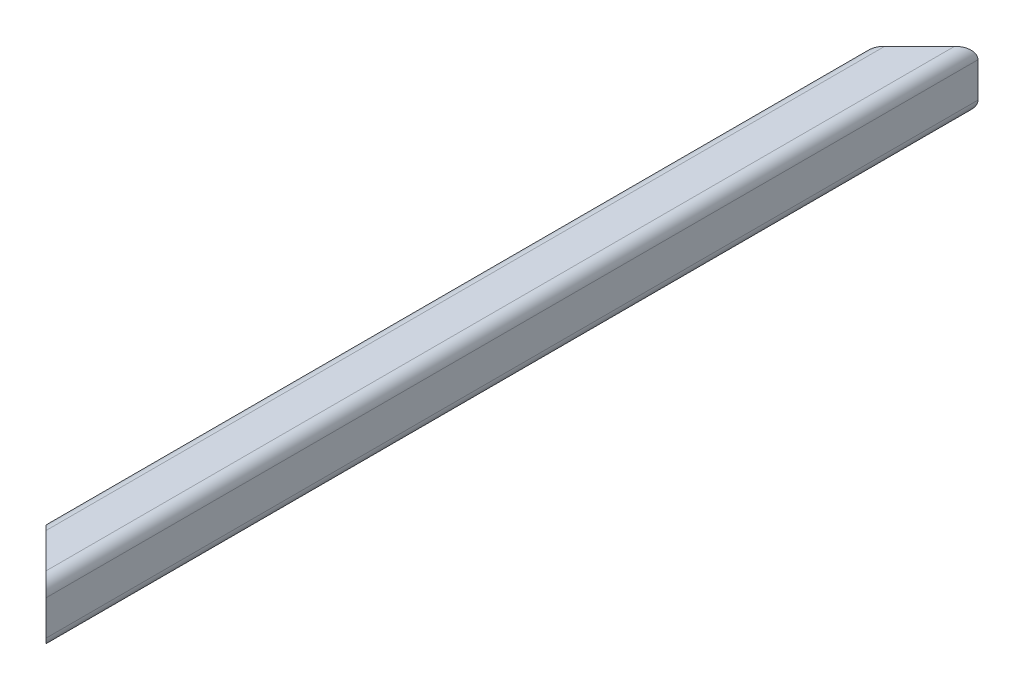
ISO-10303-21;
HEADER;
FILE_DESCRIPTION(('STEP AP214'),'2;1');
FILE_NAME('part.step','',(''),(''),'','','');
FILE_SCHEMA(('AUTOMOTIVE_DESIGN { 1 0 10303 214 1 1 1 1 }'));
ENDSEC;
DATA;
#1=APPLICATION_CONTEXT('core data for automotive mechanical design processes');
#2=APPLICATION_PROTOCOL_DEFINITION('international standard','automotive_design',2000,#1);
#3=PRODUCT_CONTEXT('',#1,'mechanical');
#4=PRODUCT('Part','Part','',(#3));
#5=PRODUCT_RELATED_PRODUCT_CATEGORY('part','',(#4));
#6=PRODUCT_DEFINITION_FORMATION('','',#4);
#7=PRODUCT_DEFINITION_CONTEXT('part definition',#1,'design');
#8=PRODUCT_DEFINITION('design','',#6,#7);
#9=PRODUCT_DEFINITION_SHAPE('','',#8);
#10=(LENGTH_UNIT() NAMED_UNIT(*) SI_UNIT(.MILLI.,.METRE.));
#11=(NAMED_UNIT(*) PLANE_ANGLE_UNIT() SI_UNIT($,.RADIAN.));
#12=(NAMED_UNIT(*) SI_UNIT($,.STERADIAN.) SOLID_ANGLE_UNIT());
#13=UNCERTAINTY_MEASURE_WITH_UNIT(LENGTH_MEASURE(1.E-05),#10,'distance_accuracy_value','');
#14=(GEOMETRIC_REPRESENTATION_CONTEXT(3) GLOBAL_UNCERTAINTY_ASSIGNED_CONTEXT((#13)) GLOBAL_UNIT_ASSIGNED_CONTEXT((#10,
#11,#12)) REPRESENTATION_CONTEXT('',''));
#15=CARTESIAN_POINT('',(0.,0.,0.));
#16=DIRECTION('',(0.,0.,1.));
#17=DIRECTION('',(1.,0.,0.));
#18=AXIS2_PLACEMENT_3D('',#15,#16,#17);
#19=CARTESIAN_POINT('',(256.,226.,-2000.));
#20=DIRECTION('',(0.,0.,-1.));
#21=DIRECTION('',(-1.,0.,0.));
#22=AXIS2_PLACEMENT_3D('',#19,#20,#21);
#23=CYLINDRICAL_SURFACE('',#22,4.);
#24=CARTESIAN_POINT('',(256.,226.,-2306.));
#25=DIRECTION('',(-0.707106781186548,0.,-0.707106781186547));
#26=DIRECTION('',(0.707106781186547,0.,-0.707106781186548));
#27=AXIS2_PLACEMENT_3D('',#24,#25,#26);
#28=ELLIPSE('',#27,5.65685424949239,4.);
#29=CARTESIAN_POINT('',(256.,230.,-2306.));
#30=VERTEX_POINT('',#29);
#31=CARTESIAN_POINT('',(260.,226.,-2310.));
#32=VERTEX_POINT('',#31);
#33=EDGE_CURVE('E185',#30,#32,#28,.T.);
#34=ORIENTED_EDGE('',*,*,#33,.F.);
#35=DIRECTION('',(0.,0.,-1.));
#36=VECTOR('',#35,1.);
#37=CARTESIAN_POINT('',(256.,230.,-2000.));
#38=LINE('',#37,#36);
#39=CARTESIAN_POINT('',(256.,230.,-1994.));
#40=VERTEX_POINT('',#39);
#41=EDGE_CURVE('E265',#40,#30,#38,.T.);
#42=ORIENTED_EDGE('',*,*,#41,.F.);
#43=CARTESIAN_POINT('',(256.,226.,-1994.));
#44=DIRECTION('',(-0.707106781186547,0.,0.707106781186548));
#45=DIRECTION('',(-0.707106781186548,0.,-0.707106781186547));
#46=AXIS2_PLACEMENT_3D('',#43,#44,#45);
#47=ELLIPSE('',#46,5.65685424949238,4.);
#48=CARTESIAN_POINT('',(260.,226.,-1990.));
#49=VERTEX_POINT('',#48);
#50=EDGE_CURVE('E176',#49,#40,#47,.T.);
#51=ORIENTED_EDGE('',*,*,#50,.F.);
#52=DIRECTION('',(0.,0.,-1.));
#53=VECTOR('',#52,1.);
#54=CARTESIAN_POINT('',(260.,226.,-2000.));
#55=LINE('',#54,#53);
#56=EDGE_CURVE('E45',#49,#32,#55,.T.);
#57=ORIENTED_EDGE('',*,*,#56,.T.);
#58=EDGE_LOOP('',(#34,#42,#51,#57));
#59=FACE_BOUND('',#58,.T.);
#60=ADVANCED_FACE('F41',(#59),#23,.T.);
#61=CARTESIAN_POINT('',(256.,230.,-2000.));
#62=DIRECTION('',(0.,-1.,0.));
#63=DIRECTION('',(0.,0.,-1.));
#64=AXIS2_PLACEMENT_3D('',#61,#62,#63);
#65=PLANE('',#64);
#66=DIRECTION('',(0.707106781186547,0.,-0.707106781186548));
#67=VECTOR('',#66,1.);
#68=CARTESIAN_POINT('',(103.,230.,-2153.));
#69=LINE('',#68,#67);
#70=CARTESIAN_POINT('',(244.,230.,-2294.));
#71=VERTEX_POINT('',#70);
#72=EDGE_CURVE('E182',#71,#30,#69,.T.);
#73=ORIENTED_EDGE('',*,*,#72,.F.);
#74=DIRECTION('',(0.,0.,-1.));
#75=VECTOR('',#74,1.);
#76=CARTESIAN_POINT('',(244.,230.,-2000.));
#77=LINE('',#76,#75);
#78=CARTESIAN_POINT('',(244.,230.,-2006.));
#79=VERTEX_POINT('',#78);
#80=EDGE_CURVE('E263',#79,#71,#77,.T.);
#81=ORIENTED_EDGE('',*,*,#80,.F.);
#82=DIRECTION('',(-0.707106781186548,0.,-0.707106781186547));
#83=VECTOR('',#82,1.);
#84=CARTESIAN_POINT('',(253.,230.,-1997.));
#85=LINE('',#84,#83);
#86=EDGE_CURVE('E281',#40,#79,#85,.T.);
#87=ORIENTED_EDGE('',*,*,#86,.F.);
#88=ORIENTED_EDGE('',*,*,#41,.T.);
#89=EDGE_LOOP('',(#73,#81,#87,#88));
#90=FACE_BOUND('',#89,.T.);
#91=ADVANCED_FACE('F272',(#90),#65,.F.);
#92=CARTESIAN_POINT('',(244.,226.,-2000.));
#93=DIRECTION('',(0.,0.,-1.));
#94=DIRECTION('',(-1.,0.,0.));
#95=AXIS2_PLACEMENT_3D('',#92,#93,#94);
#96=CYLINDRICAL_SURFACE('',#95,4.);
#97=CARTESIAN_POINT('',(244.,226.,-2294.));
#98=DIRECTION('',(-0.707106781186548,0.,-0.707106781186547));
#99=DIRECTION('',(0.707106781186547,0.,-0.707106781186548));
#100=AXIS2_PLACEMENT_3D('',#97,#98,#99);
#101=ELLIPSE('',#100,5.65685424949239,4.);
#102=CARTESIAN_POINT('',(240.,226.,-2290.));
#103=VERTEX_POINT('',#102);
#104=EDGE_CURVE('E11',#103,#71,#101,.T.);
#105=ORIENTED_EDGE('',*,*,#104,.F.);
#106=DIRECTION('',(0.,0.,-1.));
#107=VECTOR('',#106,1.);
#108=CARTESIAN_POINT('',(240.,226.,-2000.));
#109=LINE('',#108,#107);
#110=CARTESIAN_POINT('',(240.,226.,-2010.));
#111=VERTEX_POINT('',#110);
#112=EDGE_CURVE('E260',#111,#103,#109,.T.);
#113=ORIENTED_EDGE('',*,*,#112,.F.);
#114=CARTESIAN_POINT('',(244.,226.,-2006.));
#115=DIRECTION('',(-0.707106781186547,0.,0.707106781186548));
#116=DIRECTION('',(-0.707106781186548,0.,-0.707106781186547));
#117=AXIS2_PLACEMENT_3D('',#114,#115,#116);
#118=ELLIPSE('',#117,5.65685424949238,4.);
#119=EDGE_CURVE('E278',#79,#111,#118,.T.);
#120=ORIENTED_EDGE('',*,*,#119,.F.);
#121=ORIENTED_EDGE('',*,*,#80,.T.);
#122=EDGE_LOOP('',(#105,#113,#120,#121));
#123=FACE_BOUND('',#122,.T.);
#124=ADVANCED_FACE('F275',(#123),#96,.T.);
#125=CARTESIAN_POINT('',(240.,214.,-2000.));
#126=DIRECTION('',(1.,0.,0.));
#127=DIRECTION('',(0.,0.,-1.));
#128=AXIS2_PLACEMENT_3D('',#125,#126,#127);
#129=PLANE('',#128);
#130=DIRECTION('',(0.,1.,0.));
#131=VECTOR('',#130,1.);
#132=CARTESIAN_POINT('',(240.,214.,-2290.));
#133=LINE('',#132,#131);
#134=CARTESIAN_POINT('',(240.,214.,-2290.));
#135=VERTEX_POINT('',#134);
#136=EDGE_CURVE('E51',#135,#103,#133,.T.);
#137=ORIENTED_EDGE('',*,*,#136,.F.);
#138=DIRECTION('',(0.,0.,-1.));
#139=VECTOR('',#138,1.);
#140=CARTESIAN_POINT('',(240.,214.,-2000.));
#141=LINE('',#140,#139);
#142=CARTESIAN_POINT('',(240.,214.,-2010.));
#143=VERTEX_POINT('',#142);
#144=EDGE_CURVE('E257',#143,#135,#141,.T.);
#145=ORIENTED_EDGE('',*,*,#144,.F.);
#146=DIRECTION('',(0.,-1.,0.));
#147=VECTOR('',#146,1.);
#148=CARTESIAN_POINT('',(240.,214.,-2010.));
#149=LINE('',#148,#147);
#150=EDGE_CURVE('E280',#111,#143,#149,.T.);
#151=ORIENTED_EDGE('',*,*,#150,.F.);
#152=ORIENTED_EDGE('',*,*,#112,.T.);
#153=EDGE_LOOP('',(#137,#145,#151,#152));
#154=FACE_BOUND('',#153,.T.);
#155=ADVANCED_FACE('F291',(#154),#129,.F.);
#156=CARTESIAN_POINT('',(244.,214.,-2000.));
#157=DIRECTION('',(0.,0.,-1.));
#158=DIRECTION('',(-1.,0.,0.));
#159=AXIS2_PLACEMENT_3D('',#156,#157,#158);
#160=CYLINDRICAL_SURFACE('',#159,4.);
#161=CARTESIAN_POINT('',(244.,214.,-2294.));
#162=DIRECTION('',(-0.707106781186548,0.,-0.707106781186547));
#163=DIRECTION('',(0.707106781186547,0.,-0.707106781186548));
#164=AXIS2_PLACEMENT_3D('',#161,#162,#163);
#165=ELLIPSE('',#164,5.65685424949239,4.);
#166=CARTESIAN_POINT('',(244.,210.,-2294.));
#167=VERTEX_POINT('',#166);
#168=EDGE_CURVE('E200',#167,#135,#165,.T.);
#169=ORIENTED_EDGE('',*,*,#168,.F.);
#170=DIRECTION('',(0.,0.,-1.));
#171=VECTOR('',#170,1.);
#172=CARTESIAN_POINT('',(244.,210.,-2000.));
#173=LINE('',#172,#171);
#174=CARTESIAN_POINT('',(244.,210.,-2006.));
#175=VERTEX_POINT('',#174);
#176=EDGE_CURVE('E254',#175,#167,#173,.T.);
#177=ORIENTED_EDGE('',*,*,#176,.F.);
#178=CARTESIAN_POINT('',(244.,214.,-2006.));
#179=DIRECTION('',(-0.707106781186547,0.,0.707106781186548));
#180=DIRECTION('',(-0.707106781186548,0.,-0.707106781186547));
#181=AXIS2_PLACEMENT_3D('',#178,#179,#180);
#182=ELLIPSE('',#181,5.65685424949238,4.);
#183=EDGE_CURVE('E187',#143,#175,#182,.T.);
#184=ORIENTED_EDGE('',*,*,#183,.F.);
#185=ORIENTED_EDGE('',*,*,#144,.T.);
#186=EDGE_LOOP('',(#169,#177,#184,#185));
#187=FACE_BOUND('',#186,.T.);
#188=ADVANCED_FACE('F289',(#187),#160,.T.);
#189=CARTESIAN_POINT('',(244.,210.,-2000.));
#190=DIRECTION('',(0.,1.,0.));
#191=DIRECTION('',(0.,0.,1.));
#192=AXIS2_PLACEMENT_3D('',#189,#190,#191);
#193=PLANE('',#192);
#194=DIRECTION('',(-0.707106781186547,0.,0.707106781186548));
#195=VECTOR('',#194,1.);
#196=CARTESIAN_POINT('',(97.0000000000001,210.,-2147.));
#197=LINE('',#196,#195);
#198=CARTESIAN_POINT('',(256.,210.,-2306.));
#199=VERTEX_POINT('',#198);
#200=EDGE_CURVE('E203',#199,#167,#197,.T.);
#201=ORIENTED_EDGE('',*,*,#200,.F.);
#202=DIRECTION('',(0.,0.,-1.));
#203=VECTOR('',#202,1.);
#204=CARTESIAN_POINT('',(256.,210.,-2000.));
#205=LINE('',#204,#203);
#206=CARTESIAN_POINT('',(256.,210.,-1994.));
#207=VERTEX_POINT('',#206);
#208=EDGE_CURVE('E252',#207,#199,#205,.T.);
#209=ORIENTED_EDGE('',*,*,#208,.F.);
#210=DIRECTION('',(0.707106781186548,0.,0.707106781186547));
#211=VECTOR('',#210,1.);
#212=CARTESIAN_POINT('',(247.,210.,-2003.));
#213=LINE('',#212,#211);
#214=EDGE_CURVE('E181',#175,#207,#213,.T.);
#215=ORIENTED_EDGE('',*,*,#214,.F.);
#216=ORIENTED_EDGE('',*,*,#176,.T.);
#217=EDGE_LOOP('',(#201,#209,#215,#216));
#218=FACE_BOUND('',#217,.T.);
#219=ADVANCED_FACE('F293',(#218),#193,.F.);
#220=CARTESIAN_POINT('',(256.,214.,-2000.));
#221=DIRECTION('',(0.,0.,-1.));
#222=DIRECTION('',(-1.,0.,0.));
#223=AXIS2_PLACEMENT_3D('',#220,#221,#222);
#224=CYLINDRICAL_SURFACE('',#223,4.);
#225=CARTESIAN_POINT('',(256.,214.,-2306.));
#226=DIRECTION('',(-0.707106781186548,0.,-0.707106781186547));
#227=DIRECTION('',(0.707106781186547,0.,-0.707106781186548));
#228=AXIS2_PLACEMENT_3D('',#225,#226,#227);
#229=ELLIPSE('',#228,5.65685424949239,4.);
#230=CARTESIAN_POINT('',(260.,214.,-2310.));
#231=VERTEX_POINT('',#230);
#232=EDGE_CURVE('E164',#231,#199,#229,.T.);
#233=ORIENTED_EDGE('',*,*,#232,.F.);
#234=DIRECTION('',(0.,0.,-1.));
#235=VECTOR('',#234,1.);
#236=CARTESIAN_POINT('',(260.,214.,-2000.));
#237=LINE('',#236,#235);
#238=CARTESIAN_POINT('',(260.,214.,-1990.));
#239=VERTEX_POINT('',#238);
#240=EDGE_CURVE('E156',#239,#231,#237,.T.);
#241=ORIENTED_EDGE('',*,*,#240,.F.);
#242=CARTESIAN_POINT('',(256.,214.,-1994.));
#243=DIRECTION('',(-0.707106781186547,0.,0.707106781186548));
#244=DIRECTION('',(-0.707106781186548,0.,-0.707106781186547));
#245=AXIS2_PLACEMENT_3D('',#242,#243,#244);
#246=ELLIPSE('',#245,5.65685424949238,4.);
#247=EDGE_CURVE('E161',#207,#239,#246,.T.);
#248=ORIENTED_EDGE('',*,*,#247,.F.);
#249=ORIENTED_EDGE('',*,*,#208,.T.);
#250=EDGE_LOOP('',(#233,#241,#248,#249));
#251=FACE_BOUND('',#250,.T.);
#252=ADVANCED_FACE('F158',(#251),#224,.T.);
#253=CARTESIAN_POINT('',(244.,226.,-2000.));
#254=DIRECTION('',(0.,0.,-1.));
#255=DIRECTION('',(-1.,0.,0.));
#256=AXIS2_PLACEMENT_3D('',#253,#254,#255);
#257=CYLINDRICAL_SURFACE('',#256,2.);
#258=DIRECTION('',(0.,0.,-1.));
#259=VECTOR('',#258,1.);
#260=CARTESIAN_POINT('',(242.,226.,-2000.));
#261=LINE('',#260,#259);
#262=CARTESIAN_POINT('',(242.,226.,-2008.));
#263=VERTEX_POINT('',#262);
#264=CARTESIAN_POINT('',(242.,226.,-2292.));
#265=VERTEX_POINT('',#264);
#266=EDGE_CURVE('E209',#263,#265,#261,.T.);
#267=ORIENTED_EDGE('',*,*,#266,.T.);
#268=CARTESIAN_POINT('',(244.,226.,-2294.));
#269=DIRECTION('',(-0.707106781186548,0.,-0.707106781186547));
#270=DIRECTION('',(0.707106781186547,0.,-0.707106781186548));
#271=AXIS2_PLACEMENT_3D('',#268,#269,#270);
#272=ELLIPSE('',#271,2.82842712474619,2.);
#273=CARTESIAN_POINT('',(244.,228.,-2294.));
#274=VERTEX_POINT('',#273);
#275=EDGE_CURVE('E87',#265,#274,#272,.T.);
#276=ORIENTED_EDGE('',*,*,#275,.T.);
#277=DIRECTION('',(0.,0.,-1.));
#278=VECTOR('',#277,1.);
#279=CARTESIAN_POINT('',(244.,228.,-2000.));
#280=LINE('',#279,#278);
#281=CARTESIAN_POINT('',(244.,228.,-2006.));
#282=VERTEX_POINT('',#281);
#283=EDGE_CURVE('E212',#282,#274,#280,.T.);
#284=ORIENTED_EDGE('',*,*,#283,.F.);
#285=CARTESIAN_POINT('',(244.,226.,-2006.));
#286=DIRECTION('',(-0.707106781186547,0.,0.707106781186548));
#287=DIRECTION('',(-0.707106781186548,0.,-0.707106781186547));
#288=AXIS2_PLACEMENT_3D('',#285,#286,#287);
#289=ELLIPSE('',#288,2.82842712474619,2.);
#290=EDGE_CURVE('E208',#282,#263,#289,.T.);
#291=ORIENTED_EDGE('',*,*,#290,.T.);
#292=EDGE_LOOP('',(#267,#276,#284,#291));
#293=FACE_BOUND('',#292,.T.);
#294=ADVANCED_FACE('F301',(#293),#257,.F.);
#295=CARTESIAN_POINT('',(256.,228.,-2000.));
#296=DIRECTION('',(0.,-1.,0.));
#297=DIRECTION('',(0.,0.,-1.));
#298=AXIS2_PLACEMENT_3D('',#295,#296,#297);
#299=PLANE('',#298);
#300=ORIENTED_EDGE('',*,*,#283,.T.);
#301=DIRECTION('',(0.707106781186547,0.,-0.707106781186548));
#302=VECTOR('',#301,1.);
#303=CARTESIAN_POINT('',(103.,228.,-2153.));
#304=LINE('',#303,#302);
#305=CARTESIAN_POINT('',(256.,228.,-2306.));
#306=VERTEX_POINT('',#305);
#307=EDGE_CURVE('E60',#274,#306,#304,.T.);
#308=ORIENTED_EDGE('',*,*,#307,.T.);
#309=DIRECTION('',(0.,0.,-1.));
#310=VECTOR('',#309,1.);
#311=CARTESIAN_POINT('',(256.,228.,-2000.));
#312=LINE('',#311,#310);
#313=CARTESIAN_POINT('',(256.,228.,-1994.));
#314=VERTEX_POINT('',#313);
#315=EDGE_CURVE('E217',#314,#306,#312,.T.);
#316=ORIENTED_EDGE('',*,*,#315,.F.);
#317=DIRECTION('',(-0.707106781186548,0.,-0.707106781186547));
#318=VECTOR('',#317,1.);
#319=CARTESIAN_POINT('',(253.,228.,-1997.));
#320=LINE('',#319,#318);
#321=EDGE_CURVE('E211',#314,#282,#320,.T.);
#322=ORIENTED_EDGE('',*,*,#321,.T.);
#323=EDGE_LOOP('',(#300,#308,#316,#322));
#324=FACE_BOUND('',#323,.T.);
#325=ADVANCED_FACE('F349',(#324),#299,.T.);
#326=CARTESIAN_POINT('',(256.,226.,-2000.));
#327=DIRECTION('',(0.,0.,-1.));
#328=DIRECTION('',(-1.,0.,0.));
#329=AXIS2_PLACEMENT_3D('',#326,#327,#328);
#330=CYLINDRICAL_SURFACE('',#329,2.);
#331=ORIENTED_EDGE('',*,*,#315,.T.);
#332=CARTESIAN_POINT('',(256.,226.,-2306.));
#333=DIRECTION('',(-0.707106781186548,0.,-0.707106781186547));
#334=DIRECTION('',(0.707106781186547,0.,-0.707106781186548));
#335=AXIS2_PLACEMENT_3D('',#332,#333,#334);
#336=ELLIPSE('',#335,2.82842712474619,2.);
#337=CARTESIAN_POINT('',(258.,226.,-2308.));
#338=VERTEX_POINT('',#337);
#339=EDGE_CURVE('E213',#306,#338,#336,.T.);
#340=ORIENTED_EDGE('',*,*,#339,.T.);
#341=DIRECTION('',(0.,0.,-1.));
#342=VECTOR('',#341,1.);
#343=CARTESIAN_POINT('',(258.,226.,-2000.));
#344=LINE('',#343,#342);
#345=CARTESIAN_POINT('',(258.,226.,-1992.));
#346=VERTEX_POINT('',#345);
#347=EDGE_CURVE('E222',#346,#338,#344,.T.);
#348=ORIENTED_EDGE('',*,*,#347,.F.);
#349=CARTESIAN_POINT('',(256.,226.,-1994.));
#350=DIRECTION('',(-0.707106781186547,0.,0.707106781186548));
#351=DIRECTION('',(-0.707106781186548,0.,-0.707106781186547));
#352=AXIS2_PLACEMENT_3D('',#349,#350,#351);
#353=ELLIPSE('',#352,2.82842712474619,2.);
#354=EDGE_CURVE('E216',#346,#314,#353,.T.);
#355=ORIENTED_EDGE('',*,*,#354,.T.);
#356=EDGE_LOOP('',(#331,#340,#348,#355));
#357=FACE_BOUND('',#356,.T.);
#358=ADVANCED_FACE('F357',(#357),#330,.F.);
#359=CARTESIAN_POINT('',(258.,226.,-2000.));
#360=DIRECTION('',(-1.,0.,0.));
#361=DIRECTION('',(0.,0.,1.));
#362=AXIS2_PLACEMENT_3D('',#359,#360,#361);
#363=PLANE('',#362);
#364=ORIENTED_EDGE('',*,*,#347,.T.);
#365=DIRECTION('',(0.,-1.,0.));
#366=VECTOR('',#365,1.);
#367=CARTESIAN_POINT('',(258.,226.,-2308.));
#368=LINE('',#367,#366);
#369=CARTESIAN_POINT('',(258.,214.,-2308.));
#370=VERTEX_POINT('',#369);
#371=EDGE_CURVE('E218',#338,#370,#368,.T.);
#372=ORIENTED_EDGE('',*,*,#371,.T.);
#373=DIRECTION('',(0.,0.,-1.));
#374=VECTOR('',#373,1.);
#375=CARTESIAN_POINT('',(258.,214.,-2000.));
#376=LINE('',#375,#374);
#377=CARTESIAN_POINT('',(258.,214.,-1992.));
#378=VERTEX_POINT('',#377);
#379=EDGE_CURVE('E227',#378,#370,#376,.T.);
#380=ORIENTED_EDGE('',*,*,#379,.F.);
#381=DIRECTION('',(0.,1.,0.));
#382=VECTOR('',#381,1.);
#383=CARTESIAN_POINT('',(258.,226.,-1992.));
#384=LINE('',#383,#382);
#385=EDGE_CURVE('E221',#378,#346,#384,.T.);
#386=ORIENTED_EDGE('',*,*,#385,.T.);
#387=EDGE_LOOP('',(#364,#372,#380,#386));
#388=FACE_BOUND('',#387,.T.);
#389=ADVANCED_FACE('F365',(#388),#363,.T.);
#390=CARTESIAN_POINT('',(256.,214.,-2000.));
#391=DIRECTION('',(0.,0.,-1.));
#392=DIRECTION('',(-1.,0.,0.));
#393=AXIS2_PLACEMENT_3D('',#390,#391,#392);
#394=CYLINDRICAL_SURFACE('',#393,2.);
#395=ORIENTED_EDGE('',*,*,#379,.T.);
#396=CARTESIAN_POINT('',(256.,214.,-2306.));
#397=DIRECTION('',(-0.707106781186548,0.,-0.707106781186547));
#398=DIRECTION('',(0.707106781186547,0.,-0.707106781186548));
#399=AXIS2_PLACEMENT_3D('',#396,#397,#398);
#400=ELLIPSE('',#399,2.82842712474619,2.);
#401=CARTESIAN_POINT('',(256.,212.,-2306.));
#402=VERTEX_POINT('',#401);
#403=EDGE_CURVE('E223',#370,#402,#400,.T.);
#404=ORIENTED_EDGE('',*,*,#403,.T.);
#405=DIRECTION('',(0.,0.,-1.));
#406=VECTOR('',#405,1.);
#407=CARTESIAN_POINT('',(256.,212.,-2000.));
#408=LINE('',#407,#406);
#409=CARTESIAN_POINT('',(256.,212.,-1994.));
#410=VERTEX_POINT('',#409);
#411=EDGE_CURVE('E232',#410,#402,#408,.T.);
#412=ORIENTED_EDGE('',*,*,#411,.F.);
#413=CARTESIAN_POINT('',(256.,214.,-1994.));
#414=DIRECTION('',(-0.707106781186547,0.,0.707106781186548));
#415=DIRECTION('',(-0.707106781186548,0.,-0.707106781186547));
#416=AXIS2_PLACEMENT_3D('',#413,#414,#415);
#417=ELLIPSE('',#416,2.82842712474619,2.);
#418=EDGE_CURVE('E226',#410,#378,#417,.T.);
#419=ORIENTED_EDGE('',*,*,#418,.T.);
#420=EDGE_LOOP('',(#395,#404,#412,#419));
#421=FACE_BOUND('',#420,.T.);
#422=ADVANCED_FACE('F373',(#421),#394,.F.);
#423=CARTESIAN_POINT('',(244.,212.,-2000.));
#424=DIRECTION('',(0.,1.,0.));
#425=DIRECTION('',(0.,0.,1.));
#426=AXIS2_PLACEMENT_3D('',#423,#424,#425);
#427=PLANE('',#426);
#428=ORIENTED_EDGE('',*,*,#411,.T.);
#429=DIRECTION('',(-0.707106781186547,0.,0.707106781186548));
#430=VECTOR('',#429,1.);
#431=CARTESIAN_POINT('',(97.0000000000001,212.,-2147.));
#432=LINE('',#431,#430);
#433=CARTESIAN_POINT('',(244.,212.,-2294.));
#434=VERTEX_POINT('',#433);
#435=EDGE_CURVE('E228',#402,#434,#432,.T.);
#436=ORIENTED_EDGE('',*,*,#435,.T.);
#437=DIRECTION('',(0.,0.,-1.));
#438=VECTOR('',#437,1.);
#439=CARTESIAN_POINT('',(244.,212.,-2000.));
#440=LINE('',#439,#438);
#441=CARTESIAN_POINT('',(244.,212.,-2006.));
#442=VERTEX_POINT('',#441);
#443=EDGE_CURVE('E236',#442,#434,#440,.T.);
#444=ORIENTED_EDGE('',*,*,#443,.F.);
#445=DIRECTION('',(0.707106781186548,0.,0.707106781186547));
#446=VECTOR('',#445,1.);
#447=CARTESIAN_POINT('',(247.,212.,-2003.));
#448=LINE('',#447,#446);
#449=EDGE_CURVE('E231',#442,#410,#448,.T.);
#450=ORIENTED_EDGE('',*,*,#449,.T.);
#451=EDGE_LOOP('',(#428,#436,#444,#450));
#452=FACE_BOUND('',#451,.T.);
#453=ADVANCED_FACE('F381',(#452),#427,.T.);
#454=CARTESIAN_POINT('',(244.,214.,-2000.));
#455=DIRECTION('',(0.,0.,-1.));
#456=DIRECTION('',(-1.,0.,0.));
#457=AXIS2_PLACEMENT_3D('',#454,#455,#456);
#458=CYLINDRICAL_SURFACE('',#457,2.);
#459=ORIENTED_EDGE('',*,*,#443,.T.);
#460=CARTESIAN_POINT('',(244.,214.,-2294.));
#461=DIRECTION('',(-0.707106781186548,0.,-0.707106781186547));
#462=DIRECTION('',(0.707106781186547,0.,-0.707106781186548));
#463=AXIS2_PLACEMENT_3D('',#460,#461,#462);
#464=ELLIPSE('',#463,2.82842712474619,2.);
#465=CARTESIAN_POINT('',(242.,214.,-2292.));
#466=VERTEX_POINT('',#465);
#467=EDGE_CURVE('E233',#434,#466,#464,.T.);
#468=ORIENTED_EDGE('',*,*,#467,.T.);
#469=DIRECTION('',(0.,0.,-1.));
#470=VECTOR('',#469,1.);
#471=CARTESIAN_POINT('',(242.,214.,-2000.));
#472=LINE('',#471,#470);
#473=CARTESIAN_POINT('',(242.,214.,-2008.));
#474=VERTEX_POINT('',#473);
#475=EDGE_CURVE('E194',#474,#466,#472,.T.);
#476=ORIENTED_EDGE('',*,*,#475,.F.);
#477=CARTESIAN_POINT('',(244.,214.,-2006.));
#478=DIRECTION('',(-0.707106781186547,0.,0.707106781186548));
#479=DIRECTION('',(-0.707106781186548,0.,-0.707106781186547));
#480=AXIS2_PLACEMENT_3D('',#477,#478,#479);
#481=ELLIPSE('',#480,2.82842712474619,2.);
#482=EDGE_CURVE('E235',#474,#442,#481,.T.);
#483=ORIENTED_EDGE('',*,*,#482,.T.);
#484=EDGE_LOOP('',(#459,#468,#476,#483));
#485=FACE_BOUND('',#484,.T.);
#486=ADVANCED_FACE('F389',(#485),#458,.F.);
#487=CARTESIAN_POINT('',(242.,214.,-2000.));
#488=DIRECTION('',(1.,0.,0.));
#489=DIRECTION('',(0.,0.,-1.));
#490=AXIS2_PLACEMENT_3D('',#487,#488,#489);
#491=PLANE('',#490);
#492=ORIENTED_EDGE('',*,*,#475,.T.);
#493=DIRECTION('',(0.,1.,0.));
#494=VECTOR('',#493,1.);
#495=CARTESIAN_POINT('',(242.,214.,-2292.));
#496=LINE('',#495,#494);
#497=EDGE_CURVE('E82',#466,#265,#496,.T.);
#498=ORIENTED_EDGE('',*,*,#497,.T.);
#499=ORIENTED_EDGE('',*,*,#266,.F.);
#500=DIRECTION('',(0.,-1.,0.));
#501=VECTOR('',#500,1.);
#502=CARTESIAN_POINT('',(242.,214.,-2008.));
#503=LINE('',#502,#501);
#504=EDGE_CURVE('E169',#263,#474,#503,.T.);
#505=ORIENTED_EDGE('',*,*,#504,.T.);
#506=EDGE_LOOP('',(#492,#498,#499,#505));
#507=FACE_BOUND('',#506,.T.);
#508=ADVANCED_FACE('F397',(#507),#491,.T.);
#509=CARTESIAN_POINT('',(260.,226.,-2000.));
#510=DIRECTION('',(-1.,0.,0.));
#511=DIRECTION('',(0.,0.,1.));
#512=AXIS2_PLACEMENT_3D('',#509,#510,#511);
#513=PLANE('',#512);
#514=DIRECTION('',(0.,-1.,0.));
#515=VECTOR('',#514,1.);
#516=CARTESIAN_POINT('',(260.,226.,-2310.));
#517=LINE('',#516,#515);
#518=EDGE_CURVE('E196',#32,#231,#517,.T.);
#519=ORIENTED_EDGE('',*,*,#518,.F.);
#520=ORIENTED_EDGE('',*,*,#56,.F.);
#521=DIRECTION('',(0.,1.,0.));
#522=VECTOR('',#521,1.);
#523=CARTESIAN_POINT('',(260.,226.,-1990.));
#524=LINE('',#523,#522);
#525=EDGE_CURVE('E168',#239,#49,#524,.T.);
#526=ORIENTED_EDGE('',*,*,#525,.F.);
#527=ORIENTED_EDGE('',*,*,#240,.T.);
#528=EDGE_LOOP('',(#519,#520,#526,#527));
#529=FACE_BOUND('',#528,.T.);
#530=ADVANCED_FACE('F172',(#529),#513,.F.);
#531=CARTESIAN_POINT('',(250.,220.,-2000.));
#532=DIRECTION('',(-0.707106781186547,0.,0.707106781186548));
#533=DIRECTION('',(0.707106781186548,0.,0.707106781186547));
#534=AXIS2_PLACEMENT_3D('',#531,#532,#533);
#535=PLANE('',#534);
#536=ORIENTED_EDGE('',*,*,#290,.F.);
#537=ORIENTED_EDGE('',*,*,#321,.F.);
#538=ORIENTED_EDGE('',*,*,#354,.F.);
#539=ORIENTED_EDGE('',*,*,#385,.F.);
#540=ORIENTED_EDGE('',*,*,#418,.F.);
#541=ORIENTED_EDGE('',*,*,#449,.F.);
#542=ORIENTED_EDGE('',*,*,#482,.F.);
#543=ORIENTED_EDGE('',*,*,#504,.F.);
#544=EDGE_LOOP('',(#536,#537,#538,#539,#540,#541,#542,#543));
#545=FACE_BOUND('',#544,.T.);
#546=ORIENTED_EDGE('',*,*,#525,.T.);
#547=ORIENTED_EDGE('',*,*,#50,.T.);
#548=ORIENTED_EDGE('',*,*,#86,.T.);
#549=ORIENTED_EDGE('',*,*,#119,.T.);
#550=ORIENTED_EDGE('',*,*,#150,.T.);
#551=ORIENTED_EDGE('',*,*,#183,.T.);
#552=ORIENTED_EDGE('',*,*,#214,.T.);
#553=ORIENTED_EDGE('',*,*,#247,.T.);
#554=EDGE_LOOP('',(#546,#547,#548,#549,#550,#551,#552,#553));
#555=FACE_BOUND('',#554,.T.);
#556=ADVANCED_FACE('F179',(#545,#555),#535,.T.);
#557=CARTESIAN_POINT('',(250.,220.,-2300.));
#558=DIRECTION('',(-0.707106781186548,0.,-0.707106781186547));
#559=DIRECTION('',(-0.707106781186547,0.,0.707106781186548));
#560=AXIS2_PLACEMENT_3D('',#557,#558,#559);
#561=PLANE('',#560);
#562=ORIENTED_EDGE('',*,*,#275,.F.);
#563=ORIENTED_EDGE('',*,*,#497,.F.);
#564=ORIENTED_EDGE('',*,*,#467,.F.);
#565=ORIENTED_EDGE('',*,*,#435,.F.);
#566=ORIENTED_EDGE('',*,*,#403,.F.);
#567=ORIENTED_EDGE('',*,*,#371,.F.);
#568=ORIENTED_EDGE('',*,*,#339,.F.);
#569=ORIENTED_EDGE('',*,*,#307,.F.);
#570=EDGE_LOOP('',(#562,#563,#564,#565,#566,#567,#568,#569));
#571=FACE_BOUND('',#570,.T.);
#572=ORIENTED_EDGE('',*,*,#72,.T.);
#573=ORIENTED_EDGE('',*,*,#33,.T.);
#574=ORIENTED_EDGE('',*,*,#518,.T.);
#575=ORIENTED_EDGE('',*,*,#232,.T.);
#576=ORIENTED_EDGE('',*,*,#200,.T.);
#577=ORIENTED_EDGE('',*,*,#168,.T.);
#578=ORIENTED_EDGE('',*,*,#136,.T.);
#579=ORIENTED_EDGE('',*,*,#104,.T.);
#580=EDGE_LOOP('',(#572,#573,#574,#575,#576,#577,#578,#579));
#581=FACE_BOUND('',#580,.T.);
#582=ADVANCED_FACE('F43',(#571,#581),#561,.T.);
#583=CLOSED_SHELL('',(#60,#91,#124,#155,#188,#219,#252,#294,#325,#358,#389,#422,#453,#486,#508,
#530,#556,#582));
#584=MANIFOLD_SOLID_BREP('B2',#583);
#585=ADVANCED_BREP_SHAPE_REPRESENTATION('',(#18,#584),#14);
#586=SHAPE_DEFINITION_REPRESENTATION(#9,#585);
ENDSEC;
END-ISO-10303-21;
